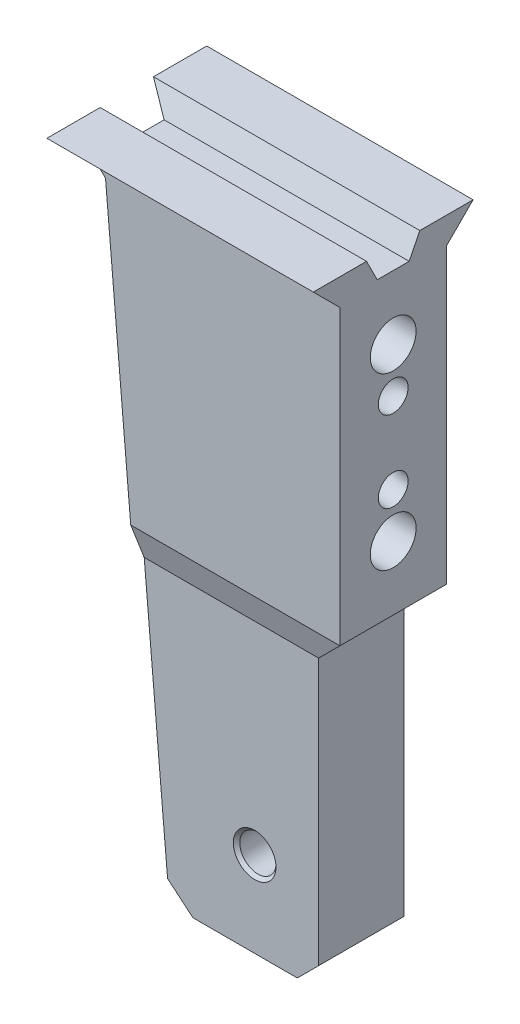
ISO-10303-21;
HEADER;
FILE_DESCRIPTION(('STEP AP214'),'2;1');
FILE_NAME('part.step','',(''),(''),'','','');
FILE_SCHEMA(('AUTOMOTIVE_DESIGN { 1 0 10303 214 1 1 1 1 }'));
ENDSEC;
DATA;
#1=APPLICATION_CONTEXT('core data for automotive mechanical design processes');
#2=APPLICATION_PROTOCOL_DEFINITION('international standard','automotive_design',2000,#1);
#3=PRODUCT_CONTEXT('',#1,'mechanical');
#4=PRODUCT('Part','Part','',(#3));
#5=PRODUCT_RELATED_PRODUCT_CATEGORY('part','',(#4));
#6=PRODUCT_DEFINITION_FORMATION('','',#4);
#7=PRODUCT_DEFINITION_CONTEXT('part definition',#1,'design');
#8=PRODUCT_DEFINITION('design','',#6,#7);
#9=PRODUCT_DEFINITION_SHAPE('','',#8);
#10=(LENGTH_UNIT() NAMED_UNIT(*) SI_UNIT(.MILLI.,.METRE.));
#11=(NAMED_UNIT(*) PLANE_ANGLE_UNIT() SI_UNIT($,.RADIAN.));
#12=(NAMED_UNIT(*) SI_UNIT($,.STERADIAN.) SOLID_ANGLE_UNIT());
#13=UNCERTAINTY_MEASURE_WITH_UNIT(LENGTH_MEASURE(1.E-05),#10,'distance_accuracy_value','');
#14=(GEOMETRIC_REPRESENTATION_CONTEXT(3) GLOBAL_UNCERTAINTY_ASSIGNED_CONTEXT((#13)) GLOBAL_UNIT_ASSIGNED_CONTEXT((#10,
#11,#12)) REPRESENTATION_CONTEXT('',''));
#15=CARTESIAN_POINT('',(0.,0.,0.));
#16=DIRECTION('',(0.,0.,1.));
#17=DIRECTION('',(1.,0.,0.));
#18=AXIS2_PLACEMENT_3D('',#15,#16,#17);
#19=CARTESIAN_POINT('',(0.,0.,15.));
#20=DIRECTION('',(0.,-1.,0.));
#21=DIRECTION('',(0.,0.,-1.));
#22=AXIS2_PLACEMENT_3D('',#19,#20,#21);
#23=PLANE('',#22);
#24=DIRECTION('',(0.,0.,-1.));
#25=VECTOR('',#24,1.);
#26=CARTESIAN_POINT('',(25.,0.,15.));
#27=LINE('',#26,#25);
#28=CARTESIAN_POINT('',(25.,0.,15.));
#29=VERTEX_POINT('',#28);
#30=CARTESIAN_POINT('',(25.,0.,10.));
#31=VERTEX_POINT('',#30);
#32=EDGE_CURVE('E196',#29,#31,#27,.T.);
#33=ORIENTED_EDGE('',*,*,#32,.T.);
#34=DIRECTION('',(1.,0.,0.));
#35=VECTOR('',#34,1.);
#36=CARTESIAN_POINT('',(0.,0.,10.));
#37=LINE('',#36,#35);
#38=CARTESIAN_POINT('',(0.,0.,10.));
#39=VERTEX_POINT('',#38);
#40=EDGE_CURVE('E171',#39,#31,#37,.T.);
#41=ORIENTED_EDGE('',*,*,#40,.F.);
#42=DIRECTION('',(0.,0.,-1.));
#43=VECTOR('',#42,1.);
#44=CARTESIAN_POINT('',(0.,0.,15.));
#45=LINE('',#44,#43);
#46=CARTESIAN_POINT('',(0.,0.,15.));
#47=VERTEX_POINT('',#46);
#48=EDGE_CURVE('E189',#47,#39,#45,.T.);
#49=ORIENTED_EDGE('',*,*,#48,.F.);
#50=DIRECTION('',(-1.,0.,0.));
#51=VECTOR('',#50,1.);
#52=CARTESIAN_POINT('',(0.,0.,15.));
#53=LINE('',#52,#51);
#54=EDGE_CURVE('E190',#29,#47,#53,.T.);
#55=ORIENTED_EDGE('',*,*,#54,.F.);
#56=EDGE_LOOP('',(#33,#41,#49,#55));
#57=FACE_BOUND('',#56,.T.);
#58=ADVANCED_FACE('F41',(#57),#23,.F.);
#59=CARTESIAN_POINT('',(3.,-3.,15.));
#60=DIRECTION('',(0.707106781186548,0.707106781186547,0.));
#61=DIRECTION('',(-0.707106781186547,0.707106781186548,0.));
#62=AXIS2_PLACEMENT_3D('',#59,#60,#61);
#63=PLANE('',#62);
#64=ORIENTED_EDGE('',*,*,#48,.T.);
#65=DIRECTION('',(0.666666666666667,-0.666666666666667,-0.333333333333334));
#66=VECTOR('',#65,1.);
#67=CARTESIAN_POINT('',(1.55555555555555,-1.55555555555555,9.22222222222222));
#68=LINE('',#67,#66);
#69=CARTESIAN_POINT('',(2.,-2.,9.));
#70=VERTEX_POINT('',#69);
#71=EDGE_CURVE('E183',#39,#70,#68,.T.);
#72=ORIENTED_EDGE('',*,*,#71,.T.);
#73=DIRECTION('',(0.,0.,-1.));
#74=VECTOR('',#73,1.);
#75=CARTESIAN_POINT('',(2.,-2.,15.));
#76=LINE('',#75,#74);
#77=CARTESIAN_POINT('',(2.,-2.,6.));
#78=VERTEX_POINT('',#77);
#79=EDGE_CURVE('E182',#70,#78,#76,.T.);
#80=ORIENTED_EDGE('',*,*,#79,.T.);
#81=DIRECTION('',(-0.666666666666667,0.666666666666667,-0.333333333333333));
#82=VECTOR('',#81,1.);
#83=CARTESIAN_POINT('',(4.88888888888889,-4.88888888888889,7.44444444444444));
#84=LINE('',#83,#82);
#85=CARTESIAN_POINT('',(0.,0.,5.));
#86=VERTEX_POINT('',#85);
#87=EDGE_CURVE('E164',#78,#86,#84,.T.);
#88=ORIENTED_EDGE('',*,*,#87,.T.);
#89=CARTESIAN_POINT('',(0.,0.,0.));
#90=VERTEX_POINT('',#89);
#91=EDGE_CURVE('E179',#86,#90,#45,.T.);
#92=ORIENTED_EDGE('',*,*,#91,.T.);
#93=DIRECTION('',(0.577350269189626,-0.577350269189626,0.577350269189625));
#94=VECTOR('',#93,1.);
#95=CARTESIAN_POINT('',(7.,-7.,6.99999999999999));
#96=LINE('',#95,#94);
#97=CARTESIAN_POINT('',(2.5,-2.5,2.5));
#98=VERTEX_POINT('',#97);
#99=EDGE_CURVE('E284',#90,#98,#96,.T.);
#100=ORIENTED_EDGE('',*,*,#99,.T.);
#101=DIRECTION('',(0.707106781186547,-0.707106781186548,0.));
#102=VECTOR('',#101,1.);
#103=CARTESIAN_POINT('',(3.,-3.,2.5));
#104=LINE('',#103,#102);
#105=CARTESIAN_POINT('',(3.,-3.,2.5));
#106=VERTEX_POINT('',#105);
#107=EDGE_CURVE('E293',#98,#106,#104,.T.);
#108=ORIENTED_EDGE('',*,*,#107,.T.);
#109=DIRECTION('',(0.,0.,-1.));
#110=VECTOR('',#109,1.);
#111=CARTESIAN_POINT('',(3.,-3.,15.));
#112=LINE('',#111,#110);
#113=CARTESIAN_POINT('',(3.,-3.,12.5));
#114=VERTEX_POINT('',#113);
#115=EDGE_CURVE('E205',#114,#106,#112,.T.);
#116=ORIENTED_EDGE('',*,*,#115,.F.);
#117=DIRECTION('',(-0.707106781186547,0.707106781186548,0.));
#118=VECTOR('',#117,1.);
#119=CARTESIAN_POINT('',(3.,-3.,12.5));
#120=LINE('',#119,#118);
#121=CARTESIAN_POINT('',(2.5,-2.5,12.5));
#122=VERTEX_POINT('',#121);
#123=EDGE_CURVE('E299',#114,#122,#120,.T.);
#124=ORIENTED_EDGE('',*,*,#123,.T.);
#125=DIRECTION('',(-0.577350269189626,0.577350269189626,0.577350269189626));
#126=VECTOR('',#125,1.);
#127=CARTESIAN_POINT('',(2.,-2.,13.));
#128=LINE('',#127,#126);
#129=EDGE_CURVE('E286',#122,#47,#128,.T.);
#130=ORIENTED_EDGE('',*,*,#129,.T.);
#131=EDGE_LOOP('',(#64,#72,#80,#88,#92,#100,#108,#116,#124,#130));
#132=FACE_BOUND('',#131,.T.);
#133=ADVANCED_FACE('F177',(#132),#63,.F.);
#134=CARTESIAN_POINT('',(8.00000000000001,-60.,15.));
#135=DIRECTION('',(0.996174723949222,0.0873837477148442,0.));
#136=DIRECTION('',(-0.0873837477148442,0.996174723949222,0.));
#137=AXIS2_PLACEMENT_3D('',#134,#135,#136);
#138=PLANE('',#137);
#139=CARTESIAN_POINT('',(3.43859649122807,-8.,7.5));
#140=DIRECTION('',(0.996174723949222,0.0873837477148442,0.));
#141=DIRECTION('',(-0.0873837477148442,0.996174723949222,0.));
#142=AXIS2_PLACEMENT_3D('',#139,#140,#141);
#143=ELLIPSE('',#142,4.01535985990736,4.);
#144=CARTESIAN_POINT('',(3.08771929824561,-4.00000000000001,7.5));
#145=VERTEX_POINT('',#144);
#146=EDGE_CURVE('E225',#145,#145,#143,.T.);
#147=ORIENTED_EDGE('',*,*,#146,.T.);
#148=EDGE_LOOP('',(#147));
#149=FACE_BOUND('',#148,.T.);
#150=CARTESIAN_POINT('',(4.8421052631579,-24.,7.5));
#151=DIRECTION('',(0.996174723949222,0.0873837477148442,0.));
#152=DIRECTION('',(-0.0873837477148442,0.996174723949222,0.));
#153=AXIS2_PLACEMENT_3D('',#150,#151,#152);
#154=ELLIPSE('',#153,4.01535985990736,4.);
#155=CARTESIAN_POINT('',(4.49122807017544,-20.,7.5));
#156=VERTEX_POINT('',#155);
#157=EDGE_CURVE('E220',#156,#156,#154,.T.);
#158=ORIENTED_EDGE('',*,*,#157,.T.);
#159=EDGE_LOOP('',(#158));
#160=FACE_BOUND('',#159,.T.);
#161=DIRECTION('',(0.0873837477148442,-0.996174723949222,0.));
#162=VECTOR('',#161,1.);
#163=CARTESIAN_POINT('',(8.00000000000001,-60.,3.5));
#164=LINE('',#163,#162);
#165=CARTESIAN_POINT('',(5.63157894736842,-33.,3.5));
#166=VERTEX_POINT('',#165);
#167=CARTESIAN_POINT('',(7.82523250457032,-58.0076505521015,3.5));
#168=VERTEX_POINT('',#167);
#169=EDGE_CURVE('E308',#166,#168,#164,.T.);
#170=ORIENTED_EDGE('',*,*,#169,.T.);
#171=DIRECTION('',(0.,0.,1.));
#172=VECTOR('',#171,1.);
#173=CARTESIAN_POINT('',(7.82523250457032,-58.0076505521015,15.));
#174=LINE('',#173,#172);
#175=CARTESIAN_POINT('',(7.82523250457032,-58.0076505521015,11.5));
#176=VERTEX_POINT('',#175);
#177=EDGE_CURVE('E11',#168,#176,#174,.T.);
#178=ORIENTED_EDGE('',*,*,#177,.T.);
#179=DIRECTION('',(-0.0873837477148442,0.996174723949222,0.));
#180=VECTOR('',#179,1.);
#181=CARTESIAN_POINT('',(8.00000000000001,-60.,11.5));
#182=LINE('',#181,#180);
#183=CARTESIAN_POINT('',(5.63157894736842,-33.,11.5));
#184=VERTEX_POINT('',#183);
#185=EDGE_CURVE('E310',#176,#184,#182,.T.);
#186=ORIENTED_EDGE('',*,*,#185,.T.);
#187=DIRECTION('',(-0.0829311708114602,0.945415347250644,0.315138449083548));
#188=VECTOR('',#187,1.);
#189=CARTESIAN_POINT('',(7.67331499312243,-56.2757909215956,3.7414030261348));
#190=LINE('',#189,#188);
#191=CARTESIAN_POINT('',(5.36842105263158,-30.,12.5));
#192=VERTEX_POINT('',#191);
#193=EDGE_CURVE('E305',#184,#192,#190,.T.);
#194=ORIENTED_EDGE('',*,*,#193,.T.);
#195=DIRECTION('',(-0.0873837477148442,0.996174723949222,0.));
#196=VECTOR('',#195,1.);
#197=CARTESIAN_POINT('',(8.00000000000001,-60.,12.5));
#198=LINE('',#197,#196);
#199=EDGE_CURVE('E296',#192,#114,#198,.T.);
#200=ORIENTED_EDGE('',*,*,#199,.T.);
#201=ORIENTED_EDGE('',*,*,#115,.T.);
#202=DIRECTION('',(0.0873837477148442,-0.996174723949222,0.));
#203=VECTOR('',#202,1.);
#204=CARTESIAN_POINT('',(8.00000000000001,-60.,2.5));
#205=LINE('',#204,#203);
#206=CARTESIAN_POINT('',(5.36842105263158,-30.,2.5));
#207=VERTEX_POINT('',#206);
#208=EDGE_CURVE('E290',#106,#207,#205,.T.);
#209=ORIENTED_EDGE('',*,*,#208,.T.);
#210=DIRECTION('',(0.0829311708114602,-0.945415347250644,0.315138449083548));
#211=VECTOR('',#210,1.);
#212=CARTESIAN_POINT('',(8.06533700137552,-60.7448418156809,12.7482806052269));
#213=LINE('',#212,#211);
#214=EDGE_CURVE('E302',#207,#166,#213,.T.);
#215=ORIENTED_EDGE('',*,*,#214,.T.);
#216=EDGE_LOOP('',(#170,#178,#186,#194,#200,#201,#209,#215));
#217=FACE_BOUND('',#216,.T.);
#218=ADVANCED_FACE('F312',(#149,#160,#217),#138,.F.);
#219=CARTESIAN_POINT('',(22.,-60.,15.));
#220=DIRECTION('',(0.,1.,0.));
#221=DIRECTION('',(0.,0.,1.));
#222=AXIS2_PLACEMENT_3D('',#219,#220,#221);
#223=PLANE('',#222);
#224=DIRECTION('',(1.,0.,0.));
#225=VECTOR('',#224,1.);
#226=CARTESIAN_POINT('',(0.,-60.,3.5));
#227=LINE('',#226,#225);
#228=CARTESIAN_POINT('',(10.2007260770646,-60.,3.5));
#229=VERTEX_POINT('',#228);
#230=CARTESIAN_POINT('',(20.,-60.,3.5));
#231=VERTEX_POINT('',#230);
#232=EDGE_CURVE('E265',#229,#231,#227,.T.);
#233=ORIENTED_EDGE('',*,*,#232,.T.);
#234=DIRECTION('',(0.,0.,1.));
#235=VECTOR('',#234,1.);
#236=CARTESIAN_POINT('',(20.,-60.,15.));
#237=LINE('',#236,#235);
#238=CARTESIAN_POINT('',(20.,-60.,11.5));
#239=VERTEX_POINT('',#238);
#240=EDGE_CURVE('E63',#231,#239,#237,.T.);
#241=ORIENTED_EDGE('',*,*,#240,.T.);
#242=DIRECTION('',(1.,0.,0.));
#243=VECTOR('',#242,1.);
#244=CARTESIAN_POINT('',(0.,-60.,11.5));
#245=LINE('',#244,#243);
#246=CARTESIAN_POINT('',(10.2007260770646,-60.,11.5));
#247=VERTEX_POINT('',#246);
#248=EDGE_CURVE('E254',#247,#239,#245,.T.);
#249=ORIENTED_EDGE('',*,*,#248,.F.);
#250=DIRECTION('',(0.,0.,-1.));
#251=VECTOR('',#250,1.);
#252=CARTESIAN_POINT('',(10.2007260770646,-60.,15.));
#253=LINE('',#252,#251);
#254=EDGE_CURVE('E244',#247,#229,#253,.T.);
#255=ORIENTED_EDGE('',*,*,#254,.T.);
#256=EDGE_LOOP('',(#233,#241,#249,#255));
#257=FACE_BOUND('',#256,.T.);
#258=ADVANCED_FACE('F267',(#257),#223,.F.);
#259=CARTESIAN_POINT('',(22.,-33.,15.));
#260=DIRECTION('',(-1.,0.,0.));
#261=DIRECTION('',(0.,-1.,0.));
#262=AXIS2_PLACEMENT_3D('',#259,#260,#261);
#263=PLANE('',#262);
#264=DIRECTION('',(0.,-1.,0.));
#265=VECTOR('',#264,1.);
#266=CARTESIAN_POINT('',(22.,-33.,11.5));
#267=LINE('',#266,#265);
#268=CARTESIAN_POINT('',(22.,-33.,11.5));
#269=VERTEX_POINT('',#268);
#270=CARTESIAN_POINT('',(22.,-58.,11.5));
#271=VERTEX_POINT('',#270);
#272=EDGE_CURVE('E216',#269,#271,#267,.T.);
#273=ORIENTED_EDGE('',*,*,#272,.T.);
#274=DIRECTION('',(0.,0.,-1.));
#275=VECTOR('',#274,1.);
#276=CARTESIAN_POINT('',(22.,-58.,15.));
#277=LINE('',#276,#275);
#278=CARTESIAN_POINT('',(22.,-58.,3.5));
#279=VERTEX_POINT('',#278);
#280=EDGE_CURVE('E219',#271,#279,#277,.T.);
#281=ORIENTED_EDGE('',*,*,#280,.T.);
#282=DIRECTION('',(0.,1.,0.));
#283=VECTOR('',#282,1.);
#284=CARTESIAN_POINT('',(22.,-33.,3.5));
#285=LINE('',#284,#283);
#286=CARTESIAN_POINT('',(22.,-33.,3.5));
#287=VERTEX_POINT('',#286);
#288=EDGE_CURVE('E214',#279,#287,#285,.T.);
#289=ORIENTED_EDGE('',*,*,#288,.T.);
#290=DIRECTION('',(0.,0.,-1.));
#291=VECTOR('',#290,1.);
#292=CARTESIAN_POINT('',(22.,-33.,15.));
#293=LINE('',#292,#291);
#294=EDGE_CURVE('E202',#269,#287,#293,.T.);
#295=ORIENTED_EDGE('',*,*,#294,.F.);
#296=EDGE_LOOP('',(#273,#281,#289,#295));
#297=FACE_BOUND('',#296,.T.);
#298=ADVANCED_FACE('F259',(#297),#263,.F.);
#299=CARTESIAN_POINT('',(25.,-30.,15.));
#300=DIRECTION('',(-0.707106781186548,0.707106781186547,0.));
#301=DIRECTION('',(-0.707106781186547,-0.707106781186548,0.));
#302=AXIS2_PLACEMENT_3D('',#299,#300,#301);
#303=PLANE('',#302);
#304=DIRECTION('',(0.,0.,-1.));
#305=VECTOR('',#304,1.);
#306=CARTESIAN_POINT('',(25.,-30.,15.));
#307=LINE('',#306,#305);
#308=CARTESIAN_POINT('',(25.,-30.,12.5));
#309=VERTEX_POINT('',#308);
#310=CARTESIAN_POINT('',(25.,-30.,2.5));
#311=VERTEX_POINT('',#310);
#312=EDGE_CURVE('E199',#309,#311,#307,.T.);
#313=ORIENTED_EDGE('',*,*,#312,.F.);
#314=DIRECTION('',(-0.688247201611685,-0.688247201611686,-0.229415733870562));
#315=VECTOR('',#314,1.);
#316=CARTESIAN_POINT('',(25.3947368421053,-29.6052631578947,12.6315789473684));
#317=LINE('',#316,#315);
#318=EDGE_CURVE('E211',#309,#269,#317,.T.);
#319=ORIENTED_EDGE('',*,*,#318,.T.);
#320=ORIENTED_EDGE('',*,*,#294,.T.);
#321=DIRECTION('',(0.688247201611685,0.688247201611686,-0.229415733870561));
#322=VECTOR('',#321,1.);
#323=CARTESIAN_POINT('',(23.0263157894737,-31.9736842105263,3.1578947368421));
#324=LINE('',#323,#322);
#325=EDGE_CURVE('E208',#287,#311,#324,.T.);
#326=ORIENTED_EDGE('',*,*,#325,.T.);
#327=EDGE_LOOP('',(#313,#319,#320,#326));
#328=FACE_BOUND('',#327,.T.);
#329=ADVANCED_FACE('F339',(#328),#303,.F.);
#330=CARTESIAN_POINT('',(25.,0.,15.));
#331=DIRECTION('',(-1.,0.,0.));
#332=DIRECTION('',(0.,-1.,0.));
#333=AXIS2_PLACEMENT_3D('',#330,#331,#332);
#334=PLANE('',#333);
#335=CARTESIAN_POINT('',(25.,-19.8,7.5));
#336=DIRECTION('',(-1.,0.,0.));
#337=DIRECTION('',(0.,-1.,0.));
#338=AXIS2_PLACEMENT_3D('',#335,#336,#337);
#339=CIRCLE('',#338,1.4);
#340=CARTESIAN_POINT('',(25.,-21.2,7.5));
#341=VERTEX_POINT('',#340);
#342=EDGE_CURVE('E233',#341,#341,#339,.F.);
#343=ORIENTED_EDGE('',*,*,#342,.F.);
#344=EDGE_LOOP('',(#343));
#345=FACE_BOUND('',#344,.T.);
#346=CARTESIAN_POINT('',(25.,-12.2,7.5));
#347=DIRECTION('',(-1.,0.,0.));
#348=DIRECTION('',(0.,-1.,0.));
#349=AXIS2_PLACEMENT_3D('',#346,#347,#348);
#350=CIRCLE('',#349,1.4);
#351=CARTESIAN_POINT('',(25.,-10.8,7.5));
#352=VERTEX_POINT('',#351);
#353=EDGE_CURVE('E230',#352,#352,#350,.F.);
#354=ORIENTED_EDGE('',*,*,#353,.F.);
#355=EDGE_LOOP('',(#354));
#356=FACE_BOUND('',#355,.T.);
#357=CARTESIAN_POINT('',(25.,-8.,7.5));
#358=DIRECTION('',(-1.,0.,0.));
#359=DIRECTION('',(0.,-1.,0.));
#360=AXIS2_PLACEMENT_3D('',#357,#358,#359);
#361=CIRCLE('',#360,2.15);
#362=CARTESIAN_POINT('',(25.,-10.15,7.5));
#363=VERTEX_POINT('',#362);
#364=EDGE_CURVE('E229',#363,#363,#361,.T.);
#365=ORIENTED_EDGE('',*,*,#364,.T.);
#366=EDGE_LOOP('',(#365));
#367=FACE_BOUND('',#366,.T.);
#368=CARTESIAN_POINT('',(25.,-24.,7.5));
#369=DIRECTION('',(-1.,0.,0.));
#370=DIRECTION('',(0.,-1.,0.));
#371=AXIS2_PLACEMENT_3D('',#368,#369,#370);
#372=CIRCLE('',#371,2.15);
#373=CARTESIAN_POINT('',(25.,-26.15,7.5));
#374=VERTEX_POINT('',#373);
#375=EDGE_CURVE('E224',#374,#374,#372,.T.);
#376=ORIENTED_EDGE('',*,*,#375,.T.);
#377=EDGE_LOOP('',(#376));
#378=FACE_BOUND('',#377,.T.);
#379=DIRECTION('',(0.,0.,-1.));
#380=VECTOR('',#379,1.);
#381=CARTESIAN_POINT('',(25.,-2.,9.));
#382=LINE('',#381,#380);
#383=CARTESIAN_POINT('',(25.,-2.,9.));
#384=VERTEX_POINT('',#383);
#385=CARTESIAN_POINT('',(25.,-2.,6.));
#386=VERTEX_POINT('',#385);
#387=EDGE_CURVE('E360',#384,#386,#382,.T.);
#388=ORIENTED_EDGE('',*,*,#387,.F.);
#389=DIRECTION('',(0.,-0.894427190999916,-0.447213595499958));
#390=VECTOR('',#389,1.);
#391=CARTESIAN_POINT('',(25.,0.,10.));
#392=LINE('',#391,#390);
#393=EDGE_CURVE('E223',#31,#384,#392,.T.);
#394=ORIENTED_EDGE('',*,*,#393,.F.);
#395=ORIENTED_EDGE('',*,*,#32,.F.);
#396=DIRECTION('',(0.,0.707106781186547,0.707106781186548));
#397=VECTOR('',#396,1.);
#398=CARTESIAN_POINT('',(25.,0.,15.));
#399=LINE('',#398,#397);
#400=CARTESIAN_POINT('',(25.,-2.5,12.5));
#401=VERTEX_POINT('',#400);
#402=EDGE_CURVE('E322',#401,#29,#399,.T.);
#403=ORIENTED_EDGE('',*,*,#402,.F.);
#404=DIRECTION('',(0.,1.,0.));
#405=VECTOR('',#404,1.);
#406=CARTESIAN_POINT('',(25.,-2.5,12.5));
#407=LINE('',#406,#405);
#408=EDGE_CURVE('E283',#309,#401,#407,.T.);
#409=ORIENTED_EDGE('',*,*,#408,.F.);
#410=ORIENTED_EDGE('',*,*,#312,.T.);
#411=DIRECTION('',(0.,-1.,0.));
#412=VECTOR('',#411,1.);
#413=CARTESIAN_POINT('',(25.,-2.5,2.5));
#414=LINE('',#413,#412);
#415=CARTESIAN_POINT('',(25.,-2.5,2.5));
#416=VERTEX_POINT('',#415);
#417=EDGE_CURVE('E276',#416,#311,#414,.T.);
#418=ORIENTED_EDGE('',*,*,#417,.F.);
#419=DIRECTION('',(0.,-0.707106781186548,0.707106781186547));
#420=VECTOR('',#419,1.);
#421=CARTESIAN_POINT('',(25.,0.,0.));
#422=LINE('',#421,#420);
#423=CARTESIAN_POINT('',(25.,0.,0.));
#424=VERTEX_POINT('',#423);
#425=EDGE_CURVE('E279',#424,#416,#422,.T.);
#426=ORIENTED_EDGE('',*,*,#425,.F.);
#427=CARTESIAN_POINT('',(25.,0.,5.));
#428=VERTEX_POINT('',#427);
#429=EDGE_CURVE('E192',#428,#424,#27,.T.);
#430=ORIENTED_EDGE('',*,*,#429,.F.);
#431=DIRECTION('',(0.,0.894427190999916,-0.447213595499958));
#432=VECTOR('',#431,1.);
#433=CARTESIAN_POINT('',(25.,-2.,6.));
#434=LINE('',#433,#432);
#435=EDGE_CURVE('E167',#386,#428,#434,.T.);
#436=ORIENTED_EDGE('',*,*,#435,.F.);
#437=EDGE_LOOP('',(#388,#394,#395,#403,#409,#410,#418,#426,#430,#436));
#438=FACE_BOUND('',#437,.T.);
#439=ADVANCED_FACE('F342',(#345,#356,#367,#378,#438),#334,.F.);
#440=ORIENTED_EDGE('',*,*,#91,.F.);
#441=DIRECTION('',(1.,0.,0.));
#442=VECTOR('',#441,1.);
#443=CARTESIAN_POINT('',(0.,0.,5.));
#444=LINE('',#443,#442);
#445=EDGE_CURVE('E161',#86,#428,#444,.T.);
#446=ORIENTED_EDGE('',*,*,#445,.T.);
#447=ORIENTED_EDGE('',*,*,#429,.T.);
#448=DIRECTION('',(-1.,0.,0.));
#449=VECTOR('',#448,1.);
#450=CARTESIAN_POINT('',(0.,0.,0.));
#451=LINE('',#450,#449);
#452=EDGE_CURVE('E188',#424,#90,#451,.T.);
#453=ORIENTED_EDGE('',*,*,#452,.T.);
#454=EDGE_LOOP('',(#440,#446,#447,#453));
#455=FACE_BOUND('',#454,.T.);
#456=ADVANCED_FACE('F186',(#455),#23,.F.);
#457=CARTESIAN_POINT('',(0.,-33.,3.5));
#458=DIRECTION('',(0.,0.,1.));
#459=DIRECTION('',(1.,0.,0.));
#460=AXIS2_PLACEMENT_3D('',#457,#458,#459);
#461=PLANE('',#460);
#462=CARTESIAN_POINT('',(16.,-52.,3.5));
#463=DIRECTION('',(0.,0.,1.));
#464=DIRECTION('',(1.,0.,0.));
#465=AXIS2_PLACEMENT_3D('',#462,#463,#464);
#466=CIRCLE('',#465,2.);
#467=CARTESIAN_POINT('',(18.,-52.,3.5));
#468=VERTEX_POINT('',#467);
#469=EDGE_CURVE('E398',#468,#468,#466,.T.);
#470=ORIENTED_EDGE('',*,*,#469,.T.);
#471=EDGE_LOOP('',(#470));
#472=FACE_BOUND('',#471,.T.);
#473=ORIENTED_EDGE('',*,*,#288,.F.);
#474=DIRECTION('',(0.70710678118655,0.707106781186545,0.));
#475=VECTOR('',#474,1.);
#476=CARTESIAN_POINT('',(22.,-58.,3.5));
#477=LINE('',#476,#475);
#478=EDGE_CURVE('E242',#279,#231,#477,.F.);
#479=ORIENTED_EDGE('',*,*,#478,.T.);
#480=ORIENTED_EDGE('',*,*,#232,.F.);
#481=DIRECTION('',(0.766191543125792,-0.642612261976472,0.));
#482=VECTOR('',#481,1.);
#483=CARTESIAN_POINT('',(10.2007260770646,-60.,3.5));
#484=LINE('',#483,#482);
#485=EDGE_CURVE('E240',#229,#168,#484,.F.);
#486=ORIENTED_EDGE('',*,*,#485,.T.);
#487=ORIENTED_EDGE('',*,*,#169,.F.);
#488=DIRECTION('',(1.,0.,0.));
#489=VECTOR('',#488,1.);
#490=CARTESIAN_POINT('',(0.,-33.,3.5));
#491=LINE('',#490,#489);
#492=EDGE_CURVE('E269',#166,#287,#491,.T.);
#493=ORIENTED_EDGE('',*,*,#492,.T.);
#494=EDGE_LOOP('',(#473,#479,#480,#486,#487,#493));
#495=FACE_BOUND('',#494,.T.);
#496=ADVANCED_FACE('F264',(#472,#495),#461,.F.);
#497=CARTESIAN_POINT('',(0.,-30.,2.5));
#498=DIRECTION('',(0.,0.316227766016837,0.948683298050514));
#499=DIRECTION('',(0.,-0.948683298050514,0.316227766016837));
#500=AXIS2_PLACEMENT_3D('',#497,#498,#499);
#501=PLANE('',#500);
#502=DIRECTION('',(1.,0.,0.));
#503=VECTOR('',#502,1.);
#504=CARTESIAN_POINT('',(0.,-30.,2.5));
#505=LINE('',#504,#503);
#506=EDGE_CURVE('E271',#207,#311,#505,.T.);
#507=ORIENTED_EDGE('',*,*,#506,.T.);
#508=ORIENTED_EDGE('',*,*,#325,.F.);
#509=ORIENTED_EDGE('',*,*,#492,.F.);
#510=ORIENTED_EDGE('',*,*,#214,.F.);
#511=EDGE_LOOP('',(#507,#508,#509,#510));
#512=FACE_BOUND('',#511,.T.);
#513=ADVANCED_FACE('F329',(#512),#501,.F.);
#514=CARTESIAN_POINT('',(0.,-2.5,2.5));
#515=DIRECTION('',(0.,0.,1.));
#516=DIRECTION('',(0.,-1.,0.));
#517=AXIS2_PLACEMENT_3D('',#514,#515,#516);
#518=PLANE('',#517);
#519=DIRECTION('',(1.,0.,0.));
#520=VECTOR('',#519,1.);
#521=CARTESIAN_POINT('',(0.,-2.5,2.5));
#522=LINE('',#521,#520);
#523=EDGE_CURVE('E280',#98,#416,#522,.T.);
#524=ORIENTED_EDGE('',*,*,#523,.T.);
#525=ORIENTED_EDGE('',*,*,#417,.T.);
#526=ORIENTED_EDGE('',*,*,#506,.F.);
#527=ORIENTED_EDGE('',*,*,#208,.F.);
#528=ORIENTED_EDGE('',*,*,#107,.F.);
#529=EDGE_LOOP('',(#524,#525,#526,#527,#528));
#530=FACE_BOUND('',#529,.T.);
#531=ADVANCED_FACE('F333',(#530),#518,.F.);
#532=CARTESIAN_POINT('',(0.,0.,0.));
#533=DIRECTION('',(0.,0.707106781186547,0.707106781186548));
#534=DIRECTION('',(0.,-0.707106781186548,0.707106781186547));
#535=AXIS2_PLACEMENT_3D('',#532,#533,#534);
#536=PLANE('',#535);
#537=ORIENTED_EDGE('',*,*,#452,.F.);
#538=ORIENTED_EDGE('',*,*,#425,.T.);
#539=ORIENTED_EDGE('',*,*,#523,.F.);
#540=ORIENTED_EDGE('',*,*,#99,.F.);
#541=EDGE_LOOP('',(#537,#538,#539,#540));
#542=FACE_BOUND('',#541,.T.);
#543=ADVANCED_FACE('F357',(#542),#536,.F.);
#544=CARTESIAN_POINT('',(0.,-33.,11.5));
#545=DIRECTION('',(0.,0.,-1.));
#546=DIRECTION('',(-1.,0.,0.));
#547=AXIS2_PLACEMENT_3D('',#544,#545,#546);
#548=PLANE('',#547);
#549=CARTESIAN_POINT('',(16.,-52.,11.5));
#550=DIRECTION('',(0.,0.,1.));
#551=DIRECTION('',(1.,0.,0.));
#552=AXIS2_PLACEMENT_3D('',#549,#550,#551);
#553=CIRCLE('',#552,2.);
#554=CARTESIAN_POINT('',(18.,-52.,11.5));
#555=VERTEX_POINT('',#554);
#556=EDGE_CURVE('E395',#555,#555,#553,.T.);
#557=ORIENTED_EDGE('',*,*,#556,.F.);
#558=EDGE_LOOP('',(#557));
#559=FACE_BOUND('',#558,.T.);
#560=ORIENTED_EDGE('',*,*,#248,.T.);
#561=DIRECTION('',(-0.70710678118655,-0.707106781186545,0.));
#562=VECTOR('',#561,1.);
#563=CARTESIAN_POINT('',(22.,-58.,11.5));
#564=LINE('',#563,#562);
#565=EDGE_CURVE('E50',#239,#271,#564,.F.);
#566=ORIENTED_EDGE('',*,*,#565,.T.);
#567=ORIENTED_EDGE('',*,*,#272,.F.);
#568=DIRECTION('',(1.,0.,0.));
#569=VECTOR('',#568,1.);
#570=CARTESIAN_POINT('',(0.,-33.,11.5));
#571=LINE('',#570,#569);
#572=EDGE_CURVE('E317',#184,#269,#571,.T.);
#573=ORIENTED_EDGE('',*,*,#572,.F.);
#574=ORIENTED_EDGE('',*,*,#185,.F.);
#575=DIRECTION('',(-0.766191543125792,0.642612261976472,0.));
#576=VECTOR('',#575,1.);
#577=CARTESIAN_POINT('',(10.2007260770646,-60.,11.5));
#578=LINE('',#577,#576);
#579=EDGE_CURVE('E248',#176,#247,#578,.F.);
#580=ORIENTED_EDGE('',*,*,#579,.T.);
#581=EDGE_LOOP('',(#560,#566,#567,#573,#574,#580));
#582=FACE_BOUND('',#581,.T.);
#583=ADVANCED_FACE('F251',(#559,#582),#548,.F.);
#584=CARTESIAN_POINT('',(0.,-30.,12.5));
#585=DIRECTION('',(0.,0.316227766016838,-0.948683298050514));
#586=DIRECTION('',(0.,0.948683298050514,0.316227766016838));
#587=AXIS2_PLACEMENT_3D('',#584,#585,#586);
#588=PLANE('',#587);
#589=ORIENTED_EDGE('',*,*,#572,.T.);
#590=ORIENTED_EDGE('',*,*,#318,.F.);
#591=DIRECTION('',(1.,0.,0.));
#592=VECTOR('',#591,1.);
#593=CARTESIAN_POINT('',(0.,-30.,12.5));
#594=LINE('',#593,#592);
#595=EDGE_CURVE('E319',#192,#309,#594,.T.);
#596=ORIENTED_EDGE('',*,*,#595,.F.);
#597=ORIENTED_EDGE('',*,*,#193,.F.);
#598=EDGE_LOOP('',(#589,#590,#596,#597));
#599=FACE_BOUND('',#598,.T.);
#600=ADVANCED_FACE('F316',(#599),#588,.F.);
#601=CARTESIAN_POINT('',(0.,-2.5,12.5));
#602=DIRECTION('',(0.,0.,-1.));
#603=DIRECTION('',(-1.,0.,0.));
#604=AXIS2_PLACEMENT_3D('',#601,#602,#603);
#605=PLANE('',#604);
#606=ORIENTED_EDGE('',*,*,#199,.F.);
#607=ORIENTED_EDGE('',*,*,#595,.T.);
#608=ORIENTED_EDGE('',*,*,#408,.T.);
#609=DIRECTION('',(1.,0.,0.));
#610=VECTOR('',#609,1.);
#611=CARTESIAN_POINT('',(0.,-2.5,12.5));
#612=LINE('',#611,#610);
#613=EDGE_CURVE('E287',#122,#401,#612,.T.);
#614=ORIENTED_EDGE('',*,*,#613,.F.);
#615=ORIENTED_EDGE('',*,*,#123,.F.);
#616=EDGE_LOOP('',(#606,#607,#608,#614,#615));
#617=FACE_BOUND('',#616,.T.);
#618=ADVANCED_FACE('F353',(#617),#605,.F.);
#619=CARTESIAN_POINT('',(0.,0.,15.));
#620=DIRECTION('',(0.,0.707106781186548,-0.707106781186547));
#621=DIRECTION('',(0.,0.707106781186547,0.707106781186548));
#622=AXIS2_PLACEMENT_3D('',#619,#620,#621);
#623=PLANE('',#622);
#624=ORIENTED_EDGE('',*,*,#613,.T.);
#625=ORIENTED_EDGE('',*,*,#402,.T.);
#626=ORIENTED_EDGE('',*,*,#54,.T.);
#627=ORIENTED_EDGE('',*,*,#129,.F.);
#628=EDGE_LOOP('',(#624,#625,#626,#627));
#629=FACE_BOUND('',#628,.T.);
#630=ADVANCED_FACE('F352',(#629),#623,.F.);
#631=CARTESIAN_POINT('',(0.,-2.,9.));
#632=DIRECTION('',(0.,-1.,0.));
#633=DIRECTION('',(0.,0.,-1.));
#634=AXIS2_PLACEMENT_3D('',#631,#632,#633);
#635=PLANE('',#634);
#636=DIRECTION('',(1.,0.,0.));
#637=VECTOR('',#636,1.);
#638=CARTESIAN_POINT('',(0.,-2.,9.));
#639=LINE('',#638,#637);
#640=EDGE_CURVE('E361',#70,#384,#639,.T.);
#641=ORIENTED_EDGE('',*,*,#640,.T.);
#642=ORIENTED_EDGE('',*,*,#387,.T.);
#643=DIRECTION('',(1.,0.,0.));
#644=VECTOR('',#643,1.);
#645=CARTESIAN_POINT('',(0.,-2.,6.));
#646=LINE('',#645,#644);
#647=EDGE_CURVE('E172',#78,#386,#646,.T.);
#648=ORIENTED_EDGE('',*,*,#647,.F.);
#649=ORIENTED_EDGE('',*,*,#79,.F.);
#650=EDGE_LOOP('',(#641,#642,#648,#649));
#651=FACE_BOUND('',#650,.T.);
#652=ADVANCED_FACE('F500',(#651),#635,.F.);
#653=CARTESIAN_POINT('',(0.,0.,10.));
#654=DIRECTION('',(0.,-0.447213595499958,0.894427190999916));
#655=DIRECTION('',(0.,-0.894427190999916,-0.447213595499958));
#656=AXIS2_PLACEMENT_3D('',#653,#654,#655);
#657=PLANE('',#656);
#658=ORIENTED_EDGE('',*,*,#40,.T.);
#659=ORIENTED_EDGE('',*,*,#393,.T.);
#660=ORIENTED_EDGE('',*,*,#640,.F.);
#661=ORIENTED_EDGE('',*,*,#71,.F.);
#662=EDGE_LOOP('',(#658,#659,#660,#661));
#663=FACE_BOUND('',#662,.T.);
#664=ADVANCED_FACE('F371',(#663),#657,.F.);
#665=CARTESIAN_POINT('',(0.,-2.,6.));
#666=DIRECTION('',(0.,-0.447213595499958,-0.894427190999916));
#667=DIRECTION('',(0.,0.894427190999916,-0.447213595499958));
#668=AXIS2_PLACEMENT_3D('',#665,#666,#667);
#669=PLANE('',#668);
#670=ORIENTED_EDGE('',*,*,#647,.T.);
#671=ORIENTED_EDGE('',*,*,#435,.T.);
#672=ORIENTED_EDGE('',*,*,#445,.F.);
#673=ORIENTED_EDGE('',*,*,#87,.F.);
#674=EDGE_LOOP('',(#670,#671,#672,#673));
#675=FACE_BOUND('',#674,.T.);
#676=ADVANCED_FACE('F163',(#675),#669,.F.);
#677=CARTESIAN_POINT('',(0.,-24.,7.5));
#678=DIRECTION('',(-1.,0.,0.));
#679=DIRECTION('',(0.,0.,1.));
#680=AXIS2_PLACEMENT_3D('',#677,#678,#679);
#681=CYLINDRICAL_SURFACE('',#680,4.);
#682=CARTESIAN_POINT('',(15.,-24.,7.5));
#683=DIRECTION('',(-1.,0.,0.));
#684=DIRECTION('',(0.,0.,1.));
#685=AXIS2_PLACEMENT_3D('',#682,#683,#684);
#686=CIRCLE('',#685,4.);
#687=CARTESIAN_POINT('',(15.,-24.,11.5));
#688=VERTEX_POINT('',#687);
#689=EDGE_CURVE('E228',#688,#688,#686,.T.);
#690=ORIENTED_EDGE('',*,*,#689,.F.);
#691=EDGE_LOOP('',(#690));
#692=FACE_BOUND('',#691,.T.);
#693=ORIENTED_EDGE('',*,*,#157,.F.);
#694=EDGE_LOOP('',(#693));
#695=FACE_BOUND('',#694,.T.);
#696=ADVANCED_FACE('F487',(#692,#695),#681,.F.);
#697=CARTESIAN_POINT('',(0.,-24.,7.5));
#698=DIRECTION('',(-1.,0.,0.));
#699=DIRECTION('',(0.,0.,1.));
#700=AXIS2_PLACEMENT_3D('',#697,#698,#699);
#701=CYLINDRICAL_SURFACE('',#700,2.15);
#702=ORIENTED_EDGE('',*,*,#375,.F.);
#703=EDGE_LOOP('',(#702));
#704=FACE_BOUND('',#703,.T.);
#705=CARTESIAN_POINT('',(15.,-24.,7.5));
#706=DIRECTION('',(-1.,0.,0.));
#707=DIRECTION('',(0.,0.,1.));
#708=AXIS2_PLACEMENT_3D('',#705,#706,#707);
#709=CIRCLE('',#708,2.15);
#710=CARTESIAN_POINT('',(15.,-24.,9.65));
#711=VERTEX_POINT('',#710);
#712=EDGE_CURVE('E378',#711,#711,#709,.T.);
#713=ORIENTED_EDGE('',*,*,#712,.T.);
#714=EDGE_LOOP('',(#713));
#715=FACE_BOUND('',#714,.T.);
#716=ADVANCED_FACE('F490',(#704,#715),#701,.F.);
#717=CARTESIAN_POINT('',(15.,-20.,7.5));
#718=DIRECTION('',(1.,0.,0.));
#719=DIRECTION('',(0.,0.,-1.));
#720=AXIS2_PLACEMENT_3D('',#717,#718,#719);
#721=PLANE('',#720);
#722=ORIENTED_EDGE('',*,*,#712,.F.);
#723=EDGE_LOOP('',(#722));
#724=FACE_BOUND('',#723,.T.);
#725=ORIENTED_EDGE('',*,*,#689,.T.);
#726=EDGE_LOOP('',(#725));
#727=FACE_BOUND('',#726,.T.);
#728=ADVANCED_FACE('F481',(#724,#727),#721,.F.);
#729=CARTESIAN_POINT('',(0.,-8.,7.5));
#730=DIRECTION('',(-1.,0.,0.));
#731=DIRECTION('',(0.,0.,1.));
#732=AXIS2_PLACEMENT_3D('',#729,#730,#731);
#733=CYLINDRICAL_SURFACE('',#732,4.);
#734=CARTESIAN_POINT('',(15.,-8.,7.5));
#735=DIRECTION('',(-1.,0.,0.));
#736=DIRECTION('',(0.,0.,1.));
#737=AXIS2_PLACEMENT_3D('',#734,#735,#736);
#738=CIRCLE('',#737,4.);
#739=CARTESIAN_POINT('',(15.,-8.,11.5));
#740=VERTEX_POINT('',#739);
#741=EDGE_CURVE('E237',#740,#740,#738,.T.);
#742=ORIENTED_EDGE('',*,*,#741,.F.);
#743=EDGE_LOOP('',(#742));
#744=FACE_BOUND('',#743,.T.);
#745=ORIENTED_EDGE('',*,*,#146,.F.);
#746=EDGE_LOOP('',(#745));
#747=FACE_BOUND('',#746,.T.);
#748=ADVANCED_FACE('F479',(#744,#747),#733,.F.);
#749=CARTESIAN_POINT('',(0.,-8.,7.5));
#750=DIRECTION('',(-1.,0.,0.));
#751=DIRECTION('',(0.,0.,1.));
#752=AXIS2_PLACEMENT_3D('',#749,#750,#751);
#753=CYLINDRICAL_SURFACE('',#752,2.15);
#754=ORIENTED_EDGE('',*,*,#364,.F.);
#755=EDGE_LOOP('',(#754));
#756=FACE_BOUND('',#755,.T.);
#757=CARTESIAN_POINT('',(15.,-8.,7.5));
#758=DIRECTION('',(-1.,0.,0.));
#759=DIRECTION('',(0.,0.,1.));
#760=AXIS2_PLACEMENT_3D('',#757,#758,#759);
#761=CIRCLE('',#760,2.15);
#762=CARTESIAN_POINT('',(15.,-8.,9.65));
#763=VERTEX_POINT('',#762);
#764=EDGE_CURVE('E385',#763,#763,#761,.T.);
#765=ORIENTED_EDGE('',*,*,#764,.T.);
#766=EDGE_LOOP('',(#765));
#767=FACE_BOUND('',#766,.T.);
#768=ADVANCED_FACE('F474',(#756,#767),#753,.F.);
#769=CARTESIAN_POINT('',(15.,-4.00000000000001,7.5));
#770=DIRECTION('',(1.,0.,0.));
#771=DIRECTION('',(0.,0.,-1.));
#772=AXIS2_PLACEMENT_3D('',#769,#770,#771);
#773=PLANE('',#772);
#774=ORIENTED_EDGE('',*,*,#764,.F.);
#775=EDGE_LOOP('',(#774));
#776=FACE_BOUND('',#775,.T.);
#777=ORIENTED_EDGE('',*,*,#741,.T.);
#778=EDGE_LOOP('',(#777));
#779=FACE_BOUND('',#778,.T.);
#780=ADVANCED_FACE('F469',(#776,#779),#773,.F.);
#781=CARTESIAN_POINT('',(25.,-16.,7.5));
#782=DIRECTION('',(0.,0.,1.));
#783=DIRECTION('',(1.,0.,0.));
#784=AXIS2_PLACEMENT_3D('',#781,#782,#783);
#785=TOROIDAL_SURFACE('',#784,3.8,1.4);
#786=CARTESIAN_POINT('',(25.,-16.,7.5));
#787=DIRECTION('',(0.,0.,1.));
#788=DIRECTION('',(1.,0.,0.));
#789=AXIS2_PLACEMENT_3D('',#786,#787,#788);
#790=CIRCLE('',#789,5.2);
#791=EDGE_CURVE('',#352,#341,#790,.T.);
#792=ORIENTED_EDGE('',*,*,#353,.T.);
#793=ORIENTED_EDGE('',*,*,#342,.T.);
#794=ORIENTED_EDGE('',*,*,#791,.T.);
#795=ORIENTED_EDGE('',*,*,#791,.F.);
#796=EDGE_LOOP('',(#792,#794,#793,#795));
#797=FACE_BOUND('',#796,.T.);
#798=ADVANCED_FACE('F464',(#797),#785,.F.);
#799=CARTESIAN_POINT('',(22.,-58.,15.));
#800=DIRECTION('',(-0.707106781186545,0.70710678118655,0.));
#801=DIRECTION('',(0.,0.,-1.));
#802=AXIS2_PLACEMENT_3D('',#799,#800,#801);
#803=PLANE('',#802);
#804=ORIENTED_EDGE('',*,*,#565,.F.);
#805=ORIENTED_EDGE('',*,*,#240,.F.);
#806=ORIENTED_EDGE('',*,*,#478,.F.);
#807=ORIENTED_EDGE('',*,*,#280,.F.);
#808=EDGE_LOOP('',(#804,#805,#806,#807));
#809=FACE_BOUND('',#808,.T.);
#810=ADVANCED_FACE('F261',(#809),#803,.F.);
#811=CARTESIAN_POINT('',(10.2007260770646,-60.,15.));
#812=DIRECTION('',(0.642612261976472,0.766191543125791,0.));
#813=DIRECTION('',(0.,0.,-1.));
#814=AXIS2_PLACEMENT_3D('',#811,#812,#813);
#815=PLANE('',#814);
#816=ORIENTED_EDGE('',*,*,#579,.F.);
#817=ORIENTED_EDGE('',*,*,#177,.F.);
#818=ORIENTED_EDGE('',*,*,#485,.F.);
#819=ORIENTED_EDGE('',*,*,#254,.F.);
#820=EDGE_LOOP('',(#816,#817,#818,#819));
#821=FACE_BOUND('',#820,.T.);
#822=ADVANCED_FACE('F44',(#821),#815,.F.);
#823=CARTESIAN_POINT('',(16.,-52.,3.8));
#824=DIRECTION('',(0.,0.,-1.));
#825=DIRECTION('',(-1.,0.,0.));
#826=AXIS2_PLACEMENT_3D('',#823,#824,#825);
#827=CONICAL_SURFACE('',#826,1.7,0.78539816339745);
#828=ORIENTED_EDGE('',*,*,#469,.F.);
#829=EDGE_LOOP('',(#828));
#830=FACE_BOUND('',#829,.T.);
#831=CARTESIAN_POINT('',(16.,-52.,3.8));
#832=DIRECTION('',(0.,0.,1.));
#833=DIRECTION('',(1.,0.,0.));
#834=AXIS2_PLACEMENT_3D('',#831,#832,#833);
#835=CIRCLE('',#834,1.7);
#836=CARTESIAN_POINT('',(17.7,-52.,3.8));
#837=VERTEX_POINT('',#836);
#838=EDGE_CURVE('E234',#837,#837,#835,.T.);
#839=ORIENTED_EDGE('',*,*,#838,.T.);
#840=EDGE_LOOP('',(#839));
#841=FACE_BOUND('',#840,.T.);
#842=ADVANCED_FACE('F403',(#830,#841),#827,.F.);
#843=CARTESIAN_POINT('',(16.,-52.,11.5));
#844=DIRECTION('',(0.,0.,1.));
#845=DIRECTION('',(1.,0.,0.));
#846=AXIS2_PLACEMENT_3D('',#843,#844,#845);
#847=CYLINDRICAL_SURFACE('',#846,1.7);
#848=ORIENTED_EDGE('',*,*,#838,.F.);
#849=EDGE_LOOP('',(#848));
#850=FACE_BOUND('',#849,.T.);
#851=CARTESIAN_POINT('',(16.,-52.,11.2));
#852=DIRECTION('',(0.,0.,1.));
#853=DIRECTION('',(1.,0.,0.));
#854=AXIS2_PLACEMENT_3D('',#851,#852,#853);
#855=CIRCLE('',#854,1.7);
#856=CARTESIAN_POINT('',(17.7,-52.,11.2));
#857=VERTEX_POINT('',#856);
#858=EDGE_CURVE('E392',#857,#857,#855,.T.);
#859=ORIENTED_EDGE('',*,*,#858,.T.);
#860=EDGE_LOOP('',(#859));
#861=FACE_BOUND('',#860,.T.);
#862=ADVANCED_FACE('F406',(#850,#861),#847,.F.);
#863=CARTESIAN_POINT('',(16.,-52.,11.5));
#864=DIRECTION('',(0.,0.,1.));
#865=DIRECTION('',(1.,0.,0.));
#866=AXIS2_PLACEMENT_3D('',#863,#864,#865);
#867=CONICAL_SURFACE('',#866,2.,0.785398163397448);
#868=ORIENTED_EDGE('',*,*,#858,.F.);
#869=EDGE_LOOP('',(#868));
#870=FACE_BOUND('',#869,.T.);
#871=ORIENTED_EDGE('',*,*,#556,.T.);
#872=EDGE_LOOP('',(#871));
#873=FACE_BOUND('',#872,.T.);
#874=ADVANCED_FACE('F412',(#870,#873),#867,.F.);
#875=CLOSED_SHELL('',(#58,#133,#218,#258,#298,#329,#439,#456,#496,#513,#531,#543,#583,#600,#618,
#630,#652,#664,#676,#696,#716,#728,#748,#768,#780,#798,#810,#822,#842,#862,#874));
#876=MANIFOLD_SOLID_BREP('B2',#875);
#877=ADVANCED_BREP_SHAPE_REPRESENTATION('',(#18,#876),#14);
#878=SHAPE_DEFINITION_REPRESENTATION(#9,#877);
ENDSEC;
END-ISO-10303-21;
